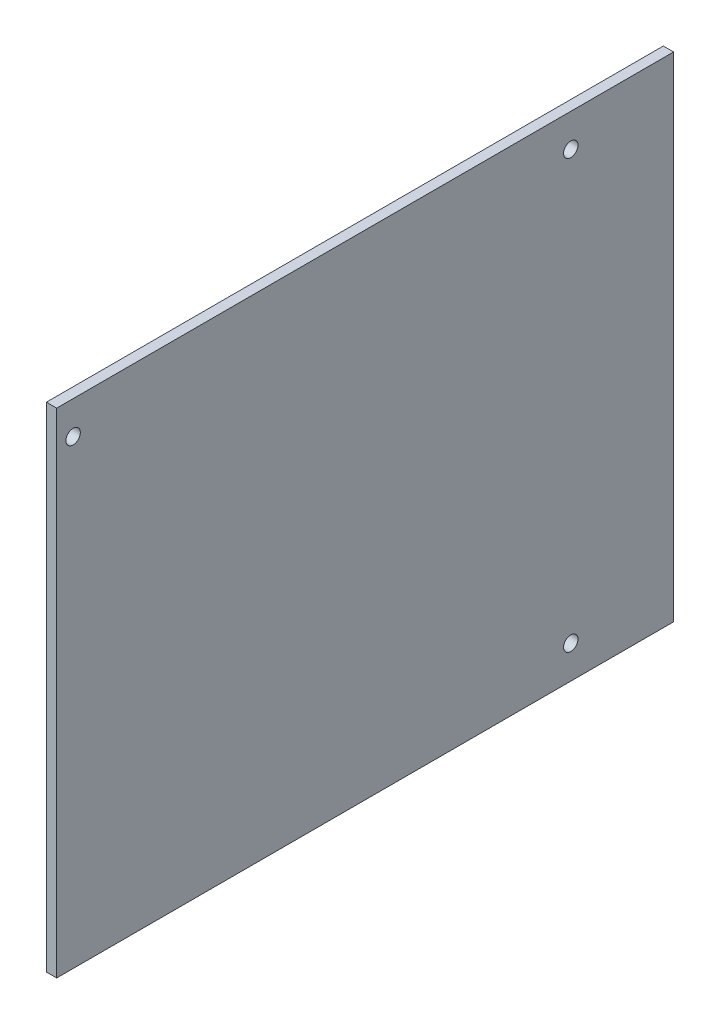
ISO-10303-21;
HEADER;
FILE_DESCRIPTION(('STEP AP214'),'2;1');
FILE_NAME('part.step','',(''),(''),'','','');
FILE_SCHEMA(('AUTOMOTIVE_DESIGN { 1 0 10303 214 1 1 1 1 }'));
ENDSEC;
DATA;
#1=APPLICATION_CONTEXT('core data for automotive mechanical design processes');
#2=APPLICATION_PROTOCOL_DEFINITION('international standard','automotive_design',2000,#1);
#3=PRODUCT_CONTEXT('',#1,'mechanical');
#4=PRODUCT('Part','Part','',(#3));
#5=PRODUCT_RELATED_PRODUCT_CATEGORY('part','',(#4));
#6=PRODUCT_DEFINITION_FORMATION('','',#4);
#7=PRODUCT_DEFINITION_CONTEXT('part definition',#1,'design');
#8=PRODUCT_DEFINITION('design','',#6,#7);
#9=PRODUCT_DEFINITION_SHAPE('','',#8);
#10=(LENGTH_UNIT() NAMED_UNIT(*) SI_UNIT(.MILLI.,.METRE.));
#11=(NAMED_UNIT(*) PLANE_ANGLE_UNIT() SI_UNIT($,.RADIAN.));
#12=(NAMED_UNIT(*) SI_UNIT($,.STERADIAN.) SOLID_ANGLE_UNIT());
#13=UNCERTAINTY_MEASURE_WITH_UNIT(LENGTH_MEASURE(1.E-05),#10,'distance_accuracy_value','');
#14=(GEOMETRIC_REPRESENTATION_CONTEXT(3) GLOBAL_UNCERTAINTY_ASSIGNED_CONTEXT((#13)) GLOBAL_UNIT_ASSIGNED_CONTEXT((#10,
#11,#12)) REPRESENTATION_CONTEXT('',''));
#15=CARTESIAN_POINT('',(0.,0.,0.));
#16=DIRECTION('',(0.,0.,1.));
#17=DIRECTION('',(1.,0.,0.));
#18=AXIS2_PLACEMENT_3D('',#15,#16,#17);
#19=CARTESIAN_POINT('',(2.5,0.,0.));
#20=DIRECTION('',(-1.,0.,0.));
#21=DIRECTION('',(0.,0.,1.));
#22=AXIS2_PLACEMENT_3D('',#19,#20,#21);
#23=PLANE('',#22);
#24=DIRECTION('',(0.,1.,0.));
#25=VECTOR('',#24,1.);
#26=CARTESIAN_POINT('',(2.5,-60.,-75.));
#27=LINE('',#26,#25);
#28=CARTESIAN_POINT('',(2.5,-60.,-75.));
#29=VERTEX_POINT('',#28);
#30=CARTESIAN_POINT('',(2.5,60.,-75.));
#31=VERTEX_POINT('',#30);
#32=EDGE_CURVE('E98',#29,#31,#27,.T.);
#33=ORIENTED_EDGE('',*,*,#32,.T.);
#34=DIRECTION('',(0.,0.,1.));
#35=VECTOR('',#34,1.);
#36=CARTESIAN_POINT('',(2.5,60.,75.));
#37=LINE('',#36,#35);
#38=CARTESIAN_POINT('',(2.5,60.,75.));
#39=VERTEX_POINT('',#38);
#40=EDGE_CURVE('E93',#31,#39,#37,.T.);
#41=ORIENTED_EDGE('',*,*,#40,.T.);
#42=DIRECTION('',(0.,-1.,0.));
#43=VECTOR('',#42,1.);
#44=CARTESIAN_POINT('',(2.5,-60.,75.));
#45=LINE('',#44,#43);
#46=CARTESIAN_POINT('',(2.5,-60.,75.));
#47=VERTEX_POINT('',#46);
#48=EDGE_CURVE('E96',#39,#47,#45,.T.);
#49=ORIENTED_EDGE('',*,*,#48,.T.);
#50=DIRECTION('',(0.,0.,-1.));
#51=VECTOR('',#50,1.);
#52=CARTESIAN_POINT('',(2.5,-60.,75.));
#53=LINE('',#52,#51);
#54=EDGE_CURVE('E63',#47,#29,#53,.T.);
#55=ORIENTED_EDGE('',*,*,#54,.T.);
#56=EDGE_LOOP('',(#33,#41,#49,#55));
#57=FACE_BOUND('',#56,.T.);
#58=CARTESIAN_POINT('',(2.5,52.,-50.));
#59=DIRECTION('',(1.,0.,0.));
#60=DIRECTION('',(0.,0.,-1.));
#61=AXIS2_PLACEMENT_3D('',#58,#59,#60);
#62=CIRCLE('',#61,1.75);
#63=CARTESIAN_POINT('',(2.5,52.,-51.75));
#64=VERTEX_POINT('',#63);
#65=EDGE_CURVE('E118',#64,#64,#62,.T.);
#66=ORIENTED_EDGE('',*,*,#65,.F.);
#67=EDGE_LOOP('',(#66));
#68=FACE_BOUND('',#67,.T.);
#69=CARTESIAN_POINT('',(2.5,52.,71.));
#70=DIRECTION('',(1.,0.,0.));
#71=DIRECTION('',(0.,0.,-1.));
#72=AXIS2_PLACEMENT_3D('',#69,#70,#71);
#73=CIRCLE('',#72,1.75);
#74=CARTESIAN_POINT('',(2.5,52.,69.25));
#75=VERTEX_POINT('',#74);
#76=EDGE_CURVE('E140',#75,#75,#73,.T.);
#77=ORIENTED_EDGE('',*,*,#76,.F.);
#78=EDGE_LOOP('',(#77));
#79=FACE_BOUND('',#78,.T.);
#80=CARTESIAN_POINT('',(2.5,-52.,-50.));
#81=DIRECTION('',(1.,0.,0.));
#82=DIRECTION('',(0.,0.,1.));
#83=AXIS2_PLACEMENT_3D('',#80,#81,#82);
#84=CIRCLE('',#83,1.75);
#85=CARTESIAN_POINT('',(2.5,-52.,-48.25));
#86=VERTEX_POINT('',#85);
#87=EDGE_CURVE('E148',#86,#86,#84,.T.);
#88=ORIENTED_EDGE('',*,*,#87,.F.);
#89=EDGE_LOOP('',(#88));
#90=FACE_BOUND('',#89,.T.);
#91=ADVANCED_FACE('F45',(#57,#68,#79,#90),#23,.F.);
#92=CARTESIAN_POINT('',(0.,0.,0.));
#93=DIRECTION('',(-1.,0.,0.));
#94=DIRECTION('',(0.,0.,1.));
#95=AXIS2_PLACEMENT_3D('',#92,#93,#94);
#96=PLANE('',#95);
#97=CARTESIAN_POINT('',(0.,52.,71.));
#98=DIRECTION('',(1.,0.,0.));
#99=DIRECTION('',(0.,0.,-1.));
#100=AXIS2_PLACEMENT_3D('',#97,#98,#99);
#101=CIRCLE('',#100,1.75);
#102=CARTESIAN_POINT('',(0.,52.,69.25));
#103=VERTEX_POINT('',#102);
#104=EDGE_CURVE('E144',#103,#103,#101,.T.);
#105=ORIENTED_EDGE('',*,*,#104,.T.);
#106=EDGE_LOOP('',(#105));
#107=FACE_BOUND('',#106,.T.);
#108=DIRECTION('',(0.,1.,0.));
#109=VECTOR('',#108,1.);
#110=CARTESIAN_POINT('',(0.,-60.,-75.));
#111=LINE('',#110,#109);
#112=CARTESIAN_POINT('',(0.,-60.,-75.));
#113=VERTEX_POINT('',#112);
#114=CARTESIAN_POINT('',(0.,60.,-75.));
#115=VERTEX_POINT('',#114);
#116=EDGE_CURVE('E114',#113,#115,#111,.T.);
#117=ORIENTED_EDGE('',*,*,#116,.F.);
#118=DIRECTION('',(0.,0.,-1.));
#119=VECTOR('',#118,1.);
#120=CARTESIAN_POINT('',(0.,-60.,75.));
#121=LINE('',#120,#119);
#122=CARTESIAN_POINT('',(0.,-60.,75.));
#123=VERTEX_POINT('',#122);
#124=EDGE_CURVE('E86',#123,#113,#121,.T.);
#125=ORIENTED_EDGE('',*,*,#124,.F.);
#126=DIRECTION('',(0.,-1.,0.));
#127=VECTOR('',#126,1.);
#128=CARTESIAN_POINT('',(0.,-60.,75.));
#129=LINE('',#128,#127);
#130=CARTESIAN_POINT('',(0.,60.,75.));
#131=VERTEX_POINT('',#130);
#132=EDGE_CURVE('E80',#131,#123,#129,.T.);
#133=ORIENTED_EDGE('',*,*,#132,.F.);
#134=DIRECTION('',(0.,0.,1.));
#135=VECTOR('',#134,1.);
#136=CARTESIAN_POINT('',(0.,60.,75.));
#137=LINE('',#136,#135);
#138=EDGE_CURVE('E103',#115,#131,#137,.T.);
#139=ORIENTED_EDGE('',*,*,#138,.F.);
#140=EDGE_LOOP('',(#117,#125,#133,#139));
#141=FACE_BOUND('',#140,.T.);
#142=CARTESIAN_POINT('',(0.,52.,-50.));
#143=DIRECTION('',(1.,0.,0.));
#144=DIRECTION('',(0.,0.,-1.));
#145=AXIS2_PLACEMENT_3D('',#142,#143,#144);
#146=CIRCLE('',#145,1.75);
#147=CARTESIAN_POINT('',(0.,52.,-51.75));
#148=VERTEX_POINT('',#147);
#149=EDGE_CURVE('E136',#148,#148,#146,.T.);
#150=ORIENTED_EDGE('',*,*,#149,.T.);
#151=EDGE_LOOP('',(#150));
#152=FACE_BOUND('',#151,.T.);
#153=CARTESIAN_POINT('',(0.,-52.,-50.));
#154=DIRECTION('',(1.,0.,0.));
#155=DIRECTION('',(0.,0.,1.));
#156=AXIS2_PLACEMENT_3D('',#153,#154,#155);
#157=CIRCLE('',#156,1.75);
#158=CARTESIAN_POINT('',(0.,-52.,-48.25));
#159=VERTEX_POINT('',#158);
#160=EDGE_CURVE('E152',#159,#159,#157,.T.);
#161=ORIENTED_EDGE('',*,*,#160,.T.);
#162=EDGE_LOOP('',(#161));
#163=FACE_BOUND('',#162,.T.);
#164=ADVANCED_FACE('F131',(#107,#141,#152,#163),#96,.T.);
#165=CARTESIAN_POINT('',(2.5,-60.,-75.));
#166=DIRECTION('',(0.,0.,1.));
#167=DIRECTION('',(1.,0.,0.));
#168=AXIS2_PLACEMENT_3D('',#165,#166,#167);
#169=PLANE('',#168);
#170=ORIENTED_EDGE('',*,*,#116,.T.);
#171=DIRECTION('',(-1.,0.,0.));
#172=VECTOR('',#171,1.);
#173=CARTESIAN_POINT('',(2.5,60.,-75.));
#174=LINE('',#173,#172);
#175=EDGE_CURVE('E11',#31,#115,#174,.T.);
#176=ORIENTED_EDGE('',*,*,#175,.F.);
#177=ORIENTED_EDGE('',*,*,#32,.F.);
#178=DIRECTION('',(-1.,0.,0.));
#179=VECTOR('',#178,1.);
#180=CARTESIAN_POINT('',(2.5,-60.,-75.));
#181=LINE('',#180,#179);
#182=EDGE_CURVE('E110',#29,#113,#181,.T.);
#183=ORIENTED_EDGE('',*,*,#182,.T.);
#184=EDGE_LOOP('',(#170,#176,#177,#183));
#185=FACE_BOUND('',#184,.T.);
#186=ADVANCED_FACE('F47',(#185),#169,.F.);
#187=CARTESIAN_POINT('',(2.5,60.,75.));
#188=DIRECTION('',(0.,-1.,0.));
#189=DIRECTION('',(0.,0.,-1.));
#190=AXIS2_PLACEMENT_3D('',#187,#188,#189);
#191=PLANE('',#190);
#192=ORIENTED_EDGE('',*,*,#138,.T.);
#193=DIRECTION('',(-1.,0.,0.));
#194=VECTOR('',#193,1.);
#195=CARTESIAN_POINT('',(2.5,60.,75.));
#196=LINE('',#195,#194);
#197=EDGE_CURVE('E55',#39,#131,#196,.T.);
#198=ORIENTED_EDGE('',*,*,#197,.F.);
#199=ORIENTED_EDGE('',*,*,#40,.F.);
#200=ORIENTED_EDGE('',*,*,#175,.T.);
#201=EDGE_LOOP('',(#192,#198,#199,#200));
#202=FACE_BOUND('',#201,.T.);
#203=ADVANCED_FACE('F102',(#202),#191,.F.);
#204=CARTESIAN_POINT('',(2.5,-60.,75.));
#205=DIRECTION('',(0.,0.,-1.));
#206=DIRECTION('',(-1.,0.,0.));
#207=AXIS2_PLACEMENT_3D('',#204,#205,#206);
#208=PLANE('',#207);
#209=ORIENTED_EDGE('',*,*,#132,.T.);
#210=DIRECTION('',(-1.,0.,0.));
#211=VECTOR('',#210,1.);
#212=CARTESIAN_POINT('',(2.5,-60.,75.));
#213=LINE('',#212,#211);
#214=EDGE_CURVE('E105',#47,#123,#213,.T.);
#215=ORIENTED_EDGE('',*,*,#214,.F.);
#216=ORIENTED_EDGE('',*,*,#48,.F.);
#217=ORIENTED_EDGE('',*,*,#197,.T.);
#218=EDGE_LOOP('',(#209,#215,#216,#217));
#219=FACE_BOUND('',#218,.T.);
#220=ADVANCED_FACE('F106',(#219),#208,.F.);
#221=CARTESIAN_POINT('',(2.5,-60.,75.));
#222=DIRECTION('',(0.,1.,0.));
#223=DIRECTION('',(0.,0.,1.));
#224=AXIS2_PLACEMENT_3D('',#221,#222,#223);
#225=PLANE('',#224);
#226=ORIENTED_EDGE('',*,*,#124,.T.);
#227=ORIENTED_EDGE('',*,*,#182,.F.);
#228=ORIENTED_EDGE('',*,*,#54,.F.);
#229=ORIENTED_EDGE('',*,*,#214,.T.);
#230=EDGE_LOOP('',(#226,#227,#228,#229));
#231=FACE_BOUND('',#230,.T.);
#232=ADVANCED_FACE('F128',(#231),#225,.F.);
#233=CARTESIAN_POINT('',(2.5,52.,-50.));
#234=DIRECTION('',(-1.,0.,0.));
#235=DIRECTION('',(0.,0.,1.));
#236=AXIS2_PLACEMENT_3D('',#233,#234,#235);
#237=CYLINDRICAL_SURFACE('',#236,1.75);
#238=ORIENTED_EDGE('',*,*,#65,.T.);
#239=EDGE_LOOP('',(#238));
#240=FACE_BOUND('',#239,.T.);
#241=ORIENTED_EDGE('',*,*,#149,.F.);
#242=EDGE_LOOP('',(#241));
#243=FACE_BOUND('',#242,.T.);
#244=ADVANCED_FACE('F171',(#240,#243),#237,.F.);
#245=CARTESIAN_POINT('',(2.5,52.,71.));
#246=DIRECTION('',(-1.,0.,0.));
#247=DIRECTION('',(0.,0.,1.));
#248=AXIS2_PLACEMENT_3D('',#245,#246,#247);
#249=CYLINDRICAL_SURFACE('',#248,1.75);
#250=ORIENTED_EDGE('',*,*,#76,.T.);
#251=EDGE_LOOP('',(#250));
#252=FACE_BOUND('',#251,.T.);
#253=ORIENTED_EDGE('',*,*,#104,.F.);
#254=EDGE_LOOP('',(#253));
#255=FACE_BOUND('',#254,.T.);
#256=ADVANCED_FACE('F216',(#252,#255),#249,.F.);
#257=CARTESIAN_POINT('',(2.5,-52.,-50.));
#258=DIRECTION('',(-1.,0.,0.));
#259=DIRECTION('',(0.,0.,1.));
#260=AXIS2_PLACEMENT_3D('',#257,#258,#259);
#261=CYLINDRICAL_SURFACE('',#260,1.75);
#262=ORIENTED_EDGE('',*,*,#87,.T.);
#263=EDGE_LOOP('',(#262));
#264=FACE_BOUND('',#263,.T.);
#265=ORIENTED_EDGE('',*,*,#160,.F.);
#266=EDGE_LOOP('',(#265));
#267=FACE_BOUND('',#266,.T.);
#268=ADVANCED_FACE('F160',(#264,#267),#261,.F.);
#269=CLOSED_SHELL('',(#91,#164,#186,#203,#220,#232,#244,#256,#268));
#270=MANIFOLD_SOLID_BREP('B2',#269);
#271=ADVANCED_BREP_SHAPE_REPRESENTATION('',(#18,#270),#14);
#272=SHAPE_DEFINITION_REPRESENTATION(#9,#271);
ENDSEC;
END-ISO-10303-21;
